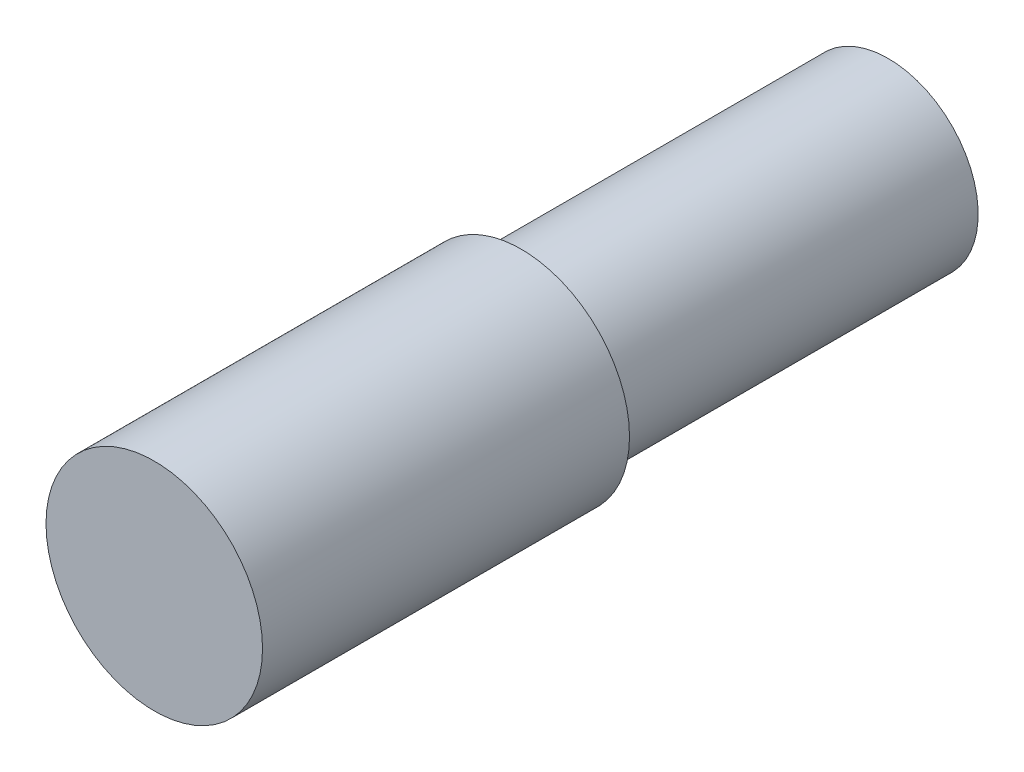
ISO-10303-21;
HEADER;
FILE_DESCRIPTION(('STEP AP214'),'2;1');
FILE_NAME('part.step','',(''),(''),'','','');
FILE_SCHEMA(('AUTOMOTIVE_DESIGN { 1 0 10303 214 1 1 1 1 }'));
ENDSEC;
DATA;
#1=APPLICATION_CONTEXT('core data for automotive mechanical design processes');
#2=APPLICATION_PROTOCOL_DEFINITION('international standard','automotive_design',2000,#1);
#3=PRODUCT_CONTEXT('',#1,'mechanical');
#4=PRODUCT('Part','Part','',(#3));
#5=PRODUCT_RELATED_PRODUCT_CATEGORY('part','',(#4));
#6=PRODUCT_DEFINITION_FORMATION('','',#4);
#7=PRODUCT_DEFINITION_CONTEXT('part definition',#1,'design');
#8=PRODUCT_DEFINITION('design','',#6,#7);
#9=PRODUCT_DEFINITION_SHAPE('','',#8);
#10=(LENGTH_UNIT() NAMED_UNIT(*) SI_UNIT(.MILLI.,.METRE.));
#11=(NAMED_UNIT(*) PLANE_ANGLE_UNIT() SI_UNIT($,.RADIAN.));
#12=(NAMED_UNIT(*) SI_UNIT($,.STERADIAN.) SOLID_ANGLE_UNIT());
#13=UNCERTAINTY_MEASURE_WITH_UNIT(LENGTH_MEASURE(1.E-05),#10,'distance_accuracy_value','');
#14=(GEOMETRIC_REPRESENTATION_CONTEXT(3) GLOBAL_UNCERTAINTY_ASSIGNED_CONTEXT((#13)) GLOBAL_UNIT_ASSIGNED_CONTEXT((#10,
#11,#12)) REPRESENTATION_CONTEXT('',''));
#15=CARTESIAN_POINT('',(0.,0.,0.));
#16=DIRECTION('',(0.,0.,1.));
#17=DIRECTION('',(1.,0.,0.));
#18=AXIS2_PLACEMENT_3D('',#15,#16,#17);
#19=CARTESIAN_POINT('',(0.,0.,10.));
#20=DIRECTION('',(0.,0.,-1.));
#21=DIRECTION('',(-1.,0.,0.));
#22=AXIS2_PLACEMENT_3D('',#19,#20,#21);
#23=CYLINDRICAL_SURFACE('',#22,2.95);
#24=CARTESIAN_POINT('',(0.,0.,10.));
#25=DIRECTION('',(0.,0.,1.));
#26=DIRECTION('',(1.,0.,0.));
#27=AXIS2_PLACEMENT_3D('',#24,#25,#26);
#28=CIRCLE('',#27,2.95);
#29=CARTESIAN_POINT('',(2.95,0.,10.));
#30=VERTEX_POINT('',#29);
#31=EDGE_CURVE('E46',#30,#30,#28,.T.);
#32=ORIENTED_EDGE('',*,*,#31,.F.);
#33=EDGE_LOOP('',(#32));
#34=FACE_BOUND('',#33,.T.);
#35=CARTESIAN_POINT('',(0.,0.,0.));
#36=DIRECTION('',(0.,0.,1.));
#37=DIRECTION('',(1.,0.,0.));
#38=AXIS2_PLACEMENT_3D('',#35,#36,#37);
#39=CIRCLE('',#38,2.95);
#40=CARTESIAN_POINT('',(2.95,0.,0.));
#41=VERTEX_POINT('',#40);
#42=EDGE_CURVE('E42',#41,#41,#39,.T.);
#43=ORIENTED_EDGE('',*,*,#42,.T.);
#44=EDGE_LOOP('',(#43));
#45=FACE_BOUND('',#44,.T.);
#46=ADVANCED_FACE('F39',(#34,#45),#23,.T.);
#47=CARTESIAN_POINT('',(0.,0.,10.));
#48=DIRECTION('',(0.,0.,1.));
#49=DIRECTION('',(1.,0.,0.));
#50=AXIS2_PLACEMENT_3D('',#47,#48,#49);
#51=PLANE('',#50);
#52=ORIENTED_EDGE('',*,*,#31,.T.);
#53=EDGE_LOOP('',(#52));
#54=FACE_BOUND('',#53,.T.);
#55=ADVANCED_FACE('F63',(#54),#51,.T.);
#56=CARTESIAN_POINT('',(0.,0.,0.));
#57=DIRECTION('',(0.,0.,1.));
#58=DIRECTION('',(1.,0.,0.));
#59=AXIS2_PLACEMENT_3D('',#56,#57,#58);
#60=PLANE('',#59);
#61=CARTESIAN_POINT('',(0.,0.,0.));
#62=DIRECTION('',(0.,0.,-1.));
#63=DIRECTION('',(-1.,0.,0.));
#64=AXIS2_PLACEMENT_3D('',#61,#62,#63);
#65=CIRCLE('',#64,2.45);
#66=CARTESIAN_POINT('',(-2.45,0.,0.));
#67=VERTEX_POINT('',#66);
#68=EDGE_CURVE('E10',#67,#67,#65,.T.);
#69=ORIENTED_EDGE('',*,*,#68,.F.);
#70=EDGE_LOOP('',(#69));
#71=FACE_BOUND('',#70,.T.);
#72=ORIENTED_EDGE('',*,*,#42,.F.);
#73=EDGE_LOOP('',(#72));
#74=FACE_BOUND('',#73,.T.);
#75=ADVANCED_FACE('F60',(#71,#74),#60,.F.);
#76=CARTESIAN_POINT('',(0.,0.,-10.));
#77=DIRECTION('',(0.,0.,1.));
#78=DIRECTION('',(1.,0.,0.));
#79=AXIS2_PLACEMENT_3D('',#76,#77,#78);
#80=CYLINDRICAL_SURFACE('',#79,2.45);
#81=CARTESIAN_POINT('',(0.,0.,-10.));
#82=DIRECTION('',(0.,0.,-1.));
#83=DIRECTION('',(-1.,0.,0.));
#84=AXIS2_PLACEMENT_3D('',#81,#82,#83);
#85=CIRCLE('',#84,2.45);
#86=CARTESIAN_POINT('',(-2.45,0.,-10.));
#87=VERTEX_POINT('',#86);
#88=EDGE_CURVE('E52',#87,#87,#85,.T.);
#89=ORIENTED_EDGE('',*,*,#88,.F.);
#90=EDGE_LOOP('',(#89));
#91=FACE_BOUND('',#90,.T.);
#92=ORIENTED_EDGE('',*,*,#68,.T.);
#93=EDGE_LOOP('',(#92));
#94=FACE_BOUND('',#93,.T.);
#95=ADVANCED_FACE('F62',(#91,#94),#80,.T.);
#96=CARTESIAN_POINT('',(0.,0.,-10.));
#97=DIRECTION('',(0.,0.,-1.));
#98=DIRECTION('',(-1.,0.,0.));
#99=AXIS2_PLACEMENT_3D('',#96,#97,#98);
#100=PLANE('',#99);
#101=ORIENTED_EDGE('',*,*,#88,.T.);
#102=EDGE_LOOP('',(#101));
#103=FACE_BOUND('',#102,.T.);
#104=ADVANCED_FACE('F69',(#103),#100,.T.);
#105=CLOSED_SHELL('',(#46,#55,#75,#95,#104));
#106=MANIFOLD_SOLID_BREP('B2',#105);
#107=ADVANCED_BREP_SHAPE_REPRESENTATION('',(#18,#106),#14);
#108=SHAPE_DEFINITION_REPRESENTATION(#9,#107);
ENDSEC;
END-ISO-10303-21;
